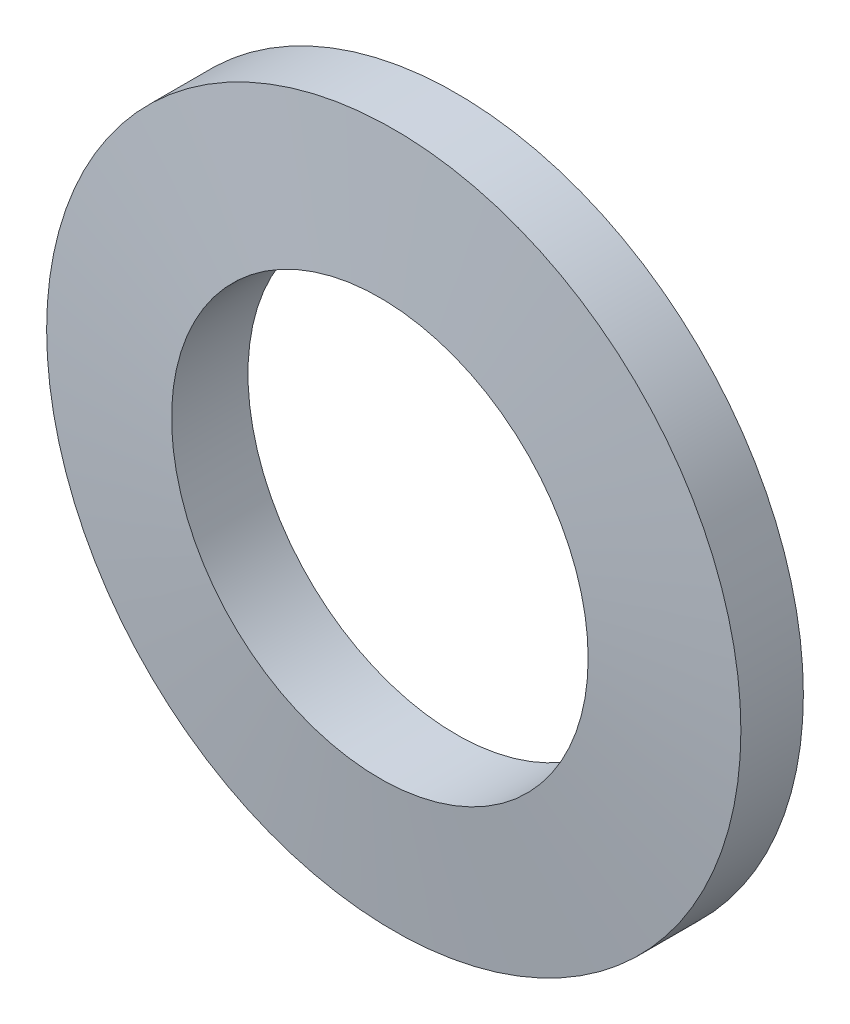
ISO-10303-21;
HEADER;
FILE_DESCRIPTION(('STEP AP214'),'2;1');
FILE_NAME('part.step','',(''),(''),'','','');
FILE_SCHEMA(('AUTOMOTIVE_DESIGN { 1 0 10303 214 1 1 1 1 }'));
ENDSEC;
DATA;
#1=APPLICATION_CONTEXT('core data for automotive mechanical design processes');
#2=APPLICATION_PROTOCOL_DEFINITION('international standard','automotive_design',2000,#1);
#3=PRODUCT_CONTEXT('',#1,'mechanical');
#4=PRODUCT('Part','Part','',(#3));
#5=PRODUCT_RELATED_PRODUCT_CATEGORY('part','',(#4));
#6=PRODUCT_DEFINITION_FORMATION('','',#4);
#7=PRODUCT_DEFINITION_CONTEXT('part definition',#1,'design');
#8=PRODUCT_DEFINITION('design','',#6,#7);
#9=PRODUCT_DEFINITION_SHAPE('','',#8);
#10=(LENGTH_UNIT() NAMED_UNIT(*) SI_UNIT(.MILLI.,.METRE.));
#11=(NAMED_UNIT(*) PLANE_ANGLE_UNIT() SI_UNIT($,.RADIAN.));
#12=(NAMED_UNIT(*) SI_UNIT($,.STERADIAN.) SOLID_ANGLE_UNIT());
#13=UNCERTAINTY_MEASURE_WITH_UNIT(LENGTH_MEASURE(1.E-05),#10,'distance_accuracy_value','');
#14=(GEOMETRIC_REPRESENTATION_CONTEXT(3) GLOBAL_UNCERTAINTY_ASSIGNED_CONTEXT((#13)) GLOBAL_UNIT_ASSIGNED_CONTEXT((#10,
#11,#12)) REPRESENTATION_CONTEXT('',''));
#15=CARTESIAN_POINT('',(0.,0.,0.));
#16=DIRECTION('',(0.,0.,1.));
#17=DIRECTION('',(1.,0.,0.));
#18=AXIS2_PLACEMENT_3D('',#15,#16,#17);
#19=CARTESIAN_POINT('',(0.,0.,-2.));
#20=DIRECTION('',(0.,0.,-1.));
#21=DIRECTION('',(-1.,0.,0.));
#22=AXIS2_PLACEMENT_3D('',#19,#20,#21);
#23=CONICAL_SURFACE('',#22,50.,1.47112767430373);
#24=CARTESIAN_POINT('',(0.,0.,0.));
#25=DIRECTION('',(0.,0.,1.));
#26=DIRECTION('',(1.,0.,0.));
#27=AXIS2_PLACEMENT_3D('',#24,#25,#26);
#28=CIRCLE('',#27,30.);
#29=CARTESIAN_POINT('',(30.,0.,0.));
#30=VERTEX_POINT('',#29);
#31=EDGE_CURVE('E10',#30,#30,#28,.T.);
#32=ORIENTED_EDGE('',*,*,#31,.F.);
#33=EDGE_LOOP('',(#32));
#34=FACE_BOUND('',#33,.T.);
#35=CARTESIAN_POINT('',(0.,0.,-2.));
#36=DIRECTION('',(0.,0.,1.));
#37=DIRECTION('',(1.,0.,0.));
#38=AXIS2_PLACEMENT_3D('',#35,#36,#37);
#39=CIRCLE('',#38,50.);
#40=CARTESIAN_POINT('',(50.,0.,-2.));
#41=VERTEX_POINT('',#40);
#42=EDGE_CURVE('E54',#41,#41,#39,.T.);
#43=ORIENTED_EDGE('',*,*,#42,.T.);
#44=EDGE_LOOP('',(#43));
#45=FACE_BOUND('',#44,.T.);
#46=ADVANCED_FACE('F35',(#34,#45),#23,.T.);
#47=CARTESIAN_POINT('',(0.,0.,0.));
#48=DIRECTION('',(0.,0.,1.));
#49=DIRECTION('',(1.,0.,0.));
#50=AXIS2_PLACEMENT_3D('',#47,#48,#49);
#51=CYLINDRICAL_SURFACE('',#50,30.);
#52=CARTESIAN_POINT('',(0.,0.,-11.));
#53=DIRECTION('',(0.,0.,1.));
#54=DIRECTION('',(1.,0.,0.));
#55=AXIS2_PLACEMENT_3D('',#52,#53,#54);
#56=CIRCLE('',#55,30.);
#57=CARTESIAN_POINT('',(30.,0.,-11.));
#58=VERTEX_POINT('',#57);
#59=EDGE_CURVE('E42',#58,#58,#56,.T.);
#60=ORIENTED_EDGE('',*,*,#59,.F.);
#61=EDGE_LOOP('',(#60));
#62=FACE_BOUND('',#61,.T.);
#63=ORIENTED_EDGE('',*,*,#31,.T.);
#64=EDGE_LOOP('',(#63));
#65=FACE_BOUND('',#64,.T.);
#66=ADVANCED_FACE('F71',(#62,#65),#51,.F.);
#67=CARTESIAN_POINT('',(0.,30.,-11.));
#68=DIRECTION('',(0.,0.,1.));
#69=DIRECTION('',(1.,0.,0.));
#70=AXIS2_PLACEMENT_3D('',#67,#68,#69);
#71=PLANE('',#70);
#72=CARTESIAN_POINT('',(0.,0.,-11.));
#73=DIRECTION('',(0.,0.,1.));
#74=DIRECTION('',(1.,0.,0.));
#75=AXIS2_PLACEMENT_3D('',#72,#73,#74);
#76=CIRCLE('',#75,50.);
#77=CARTESIAN_POINT('',(50.,0.,-11.));
#78=VERTEX_POINT('',#77);
#79=EDGE_CURVE('E48',#78,#78,#76,.T.);
#80=ORIENTED_EDGE('',*,*,#79,.F.);
#81=EDGE_LOOP('',(#80));
#82=FACE_BOUND('',#81,.T.);
#83=ORIENTED_EDGE('',*,*,#59,.T.);
#84=EDGE_LOOP('',(#83));
#85=FACE_BOUND('',#84,.T.);
#86=ADVANCED_FACE('F66',(#82,#85),#71,.F.);
#87=CARTESIAN_POINT('',(0.,0.,0.));
#88=DIRECTION('',(0.,0.,1.));
#89=DIRECTION('',(1.,0.,0.));
#90=AXIS2_PLACEMENT_3D('',#87,#88,#89);
#91=CYLINDRICAL_SURFACE('',#90,50.);
#92=ORIENTED_EDGE('',*,*,#42,.F.);
#93=EDGE_LOOP('',(#92));
#94=FACE_BOUND('',#93,.T.);
#95=ORIENTED_EDGE('',*,*,#79,.T.);
#96=EDGE_LOOP('',(#95));
#97=FACE_BOUND('',#96,.T.);
#98=ADVANCED_FACE('F63',(#94,#97),#91,.T.);
#99=CLOSED_SHELL('',(#46,#66,#86,#98));
#100=MANIFOLD_SOLID_BREP('B2',#99);
#101=ADVANCED_BREP_SHAPE_REPRESENTATION('',(#18,#100),#14);
#102=SHAPE_DEFINITION_REPRESENTATION(#9,#101);
ENDSEC;
END-ISO-10303-21;
